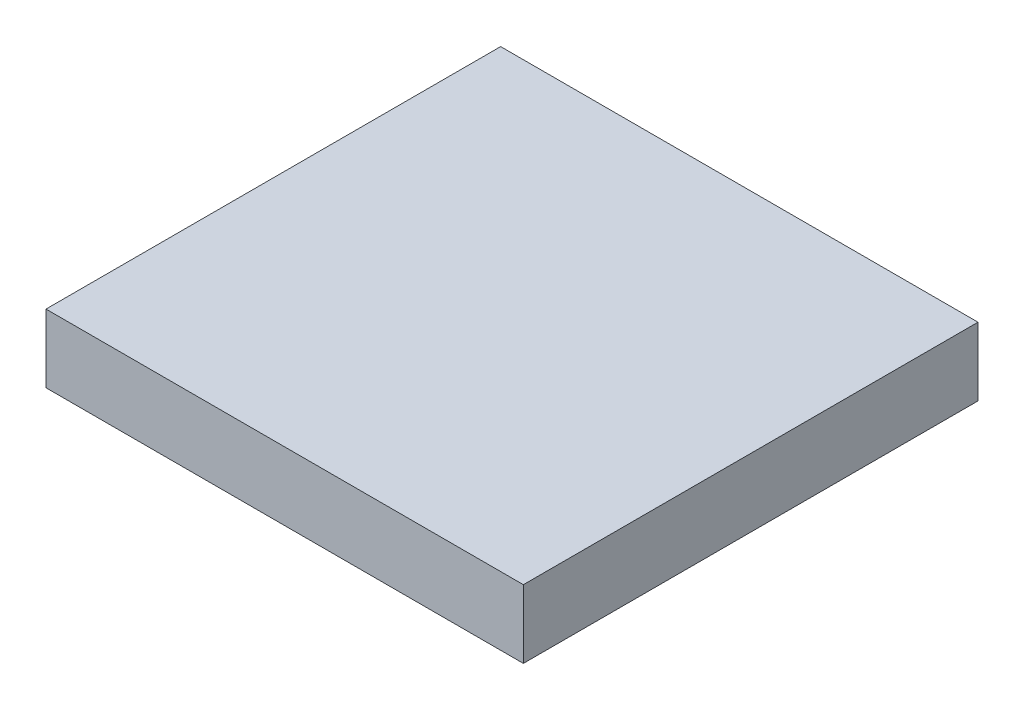
ISO-10303-21;
HEADER;
FILE_DESCRIPTION(('STEP AP214'),'2;1');
FILE_NAME('part.step','',(''),(''),'','','');
FILE_SCHEMA(('AUTOMOTIVE_DESIGN { 1 0 10303 214 1 1 1 1 }'));
ENDSEC;
DATA;
#1=APPLICATION_CONTEXT('core data for automotive mechanical design processes');
#2=APPLICATION_PROTOCOL_DEFINITION('international standard','automotive_design',2000,#1);
#3=PRODUCT_CONTEXT('',#1,'mechanical');
#4=PRODUCT('Part','Part','',(#3));
#5=PRODUCT_RELATED_PRODUCT_CATEGORY('part','',(#4));
#6=PRODUCT_DEFINITION_FORMATION('','',#4);
#7=PRODUCT_DEFINITION_CONTEXT('part definition',#1,'design');
#8=PRODUCT_DEFINITION('design','',#6,#7);
#9=PRODUCT_DEFINITION_SHAPE('','',#8);
#10=(LENGTH_UNIT() NAMED_UNIT(*) SI_UNIT(.MILLI.,.METRE.));
#11=(NAMED_UNIT(*) PLANE_ANGLE_UNIT() SI_UNIT($,.RADIAN.));
#12=(NAMED_UNIT(*) SI_UNIT($,.STERADIAN.) SOLID_ANGLE_UNIT());
#13=UNCERTAINTY_MEASURE_WITH_UNIT(LENGTH_MEASURE(1.E-05),#10,'distance_accuracy_value','');
#14=(GEOMETRIC_REPRESENTATION_CONTEXT(3) GLOBAL_UNCERTAINTY_ASSIGNED_CONTEXT((#13)) GLOBAL_UNIT_ASSIGNED_CONTEXT((#10,
#11,#12)) REPRESENTATION_CONTEXT('',''));
#15=CARTESIAN_POINT('',(0.,0.,0.));
#16=DIRECTION('',(0.,0.,1.));
#17=DIRECTION('',(1.,0.,0.));
#18=AXIS2_PLACEMENT_3D('',#15,#16,#17);
#19=CARTESIAN_POINT('',(21.,6.,-20.));
#20=DIRECTION('',(-1.,0.,0.));
#21=DIRECTION('',(0.,0.,1.));
#22=AXIS2_PLACEMENT_3D('',#19,#20,#21);
#23=PLANE('',#22);
#24=DIRECTION('',(0.,0.,-1.));
#25=VECTOR('',#24,1.);
#26=CARTESIAN_POINT('',(21.,0.,-20.));
#27=LINE('',#26,#25);
#28=CARTESIAN_POINT('',(21.,0.,20.));
#29=VERTEX_POINT('',#28);
#30=CARTESIAN_POINT('',(21.,0.,-20.));
#31=VERTEX_POINT('',#30);
#32=EDGE_CURVE('E96',#29,#31,#27,.T.);
#33=ORIENTED_EDGE('',*,*,#32,.T.);
#34=DIRECTION('',(0.,-1.,0.));
#35=VECTOR('',#34,1.);
#36=CARTESIAN_POINT('',(21.,6.,-20.));
#37=LINE('',#36,#35);
#38=CARTESIAN_POINT('',(21.,6.,-20.));
#39=VERTEX_POINT('',#38);
#40=EDGE_CURVE('E11',#39,#31,#37,.T.);
#41=ORIENTED_EDGE('',*,*,#40,.F.);
#42=DIRECTION('',(0.,0.,-1.));
#43=VECTOR('',#42,1.);
#44=CARTESIAN_POINT('',(21.,6.,-20.));
#45=LINE('',#44,#43);
#46=CARTESIAN_POINT('',(21.,6.,20.));
#47=VERTEX_POINT('',#46);
#48=EDGE_CURVE('E84',#47,#39,#45,.T.);
#49=ORIENTED_EDGE('',*,*,#48,.F.);
#50=DIRECTION('',(0.,-1.,0.));
#51=VECTOR('',#50,1.);
#52=CARTESIAN_POINT('',(21.,6.,20.));
#53=LINE('',#52,#51);
#54=EDGE_CURVE('E92',#47,#29,#53,.T.);
#55=ORIENTED_EDGE('',*,*,#54,.T.);
#56=EDGE_LOOP('',(#33,#41,#49,#55));
#57=FACE_BOUND('',#56,.T.);
#58=ADVANCED_FACE('F33',(#57),#23,.F.);
#59=CARTESIAN_POINT('',(-21.,6.,-20.));
#60=DIRECTION('',(0.,0.,1.));
#61=DIRECTION('',(1.,0.,0.));
#62=AXIS2_PLACEMENT_3D('',#59,#60,#61);
#63=PLANE('',#62);
#64=DIRECTION('',(-1.,0.,0.));
#65=VECTOR('',#64,1.);
#66=CARTESIAN_POINT('',(-21.,0.,-20.));
#67=LINE('',#66,#65);
#68=CARTESIAN_POINT('',(-21.,0.,-20.));
#69=VERTEX_POINT('',#68);
#70=EDGE_CURVE('E88',#31,#69,#67,.T.);
#71=ORIENTED_EDGE('',*,*,#70,.T.);
#72=DIRECTION('',(0.,-1.,0.));
#73=VECTOR('',#72,1.);
#74=CARTESIAN_POINT('',(-21.,6.,-20.));
#75=LINE('',#74,#73);
#76=CARTESIAN_POINT('',(-21.,6.,-20.));
#77=VERTEX_POINT('',#76);
#78=EDGE_CURVE('E41',#77,#69,#75,.T.);
#79=ORIENTED_EDGE('',*,*,#78,.F.);
#80=DIRECTION('',(-1.,0.,0.));
#81=VECTOR('',#80,1.);
#82=CARTESIAN_POINT('',(-21.,6.,-20.));
#83=LINE('',#82,#81);
#84=EDGE_CURVE('E79',#39,#77,#83,.T.);
#85=ORIENTED_EDGE('',*,*,#84,.F.);
#86=ORIENTED_EDGE('',*,*,#40,.T.);
#87=EDGE_LOOP('',(#71,#79,#85,#86));
#88=FACE_BOUND('',#87,.T.);
#89=ADVANCED_FACE('F87',(#88),#63,.F.);
#90=CARTESIAN_POINT('',(-21.,6.,-20.));
#91=DIRECTION('',(1.,0.,0.));
#92=DIRECTION('',(0.,0.,-1.));
#93=AXIS2_PLACEMENT_3D('',#90,#91,#92);
#94=PLANE('',#93);
#95=DIRECTION('',(0.,0.,1.));
#96=VECTOR('',#95,1.);
#97=CARTESIAN_POINT('',(-21.,0.,-20.));
#98=LINE('',#97,#96);
#99=CARTESIAN_POINT('',(-21.,0.,20.));
#100=VERTEX_POINT('',#99);
#101=EDGE_CURVE('E66',#69,#100,#98,.T.);
#102=ORIENTED_EDGE('',*,*,#101,.T.);
#103=DIRECTION('',(0.,-1.,0.));
#104=VECTOR('',#103,1.);
#105=CARTESIAN_POINT('',(-21.,6.,20.));
#106=LINE('',#105,#104);
#107=CARTESIAN_POINT('',(-21.,6.,20.));
#108=VERTEX_POINT('',#107);
#109=EDGE_CURVE('E89',#108,#100,#106,.T.);
#110=ORIENTED_EDGE('',*,*,#109,.F.);
#111=DIRECTION('',(0.,0.,1.));
#112=VECTOR('',#111,1.);
#113=CARTESIAN_POINT('',(-21.,6.,-20.));
#114=LINE('',#113,#112);
#115=EDGE_CURVE('E82',#77,#108,#114,.T.);
#116=ORIENTED_EDGE('',*,*,#115,.F.);
#117=ORIENTED_EDGE('',*,*,#78,.T.);
#118=EDGE_LOOP('',(#102,#110,#116,#117));
#119=FACE_BOUND('',#118,.T.);
#120=ADVANCED_FACE('F90',(#119),#94,.F.);
#121=CARTESIAN_POINT('',(-21.,6.,20.));
#122=DIRECTION('',(0.,0.,-1.));
#123=DIRECTION('',(-1.,0.,0.));
#124=AXIS2_PLACEMENT_3D('',#121,#122,#123);
#125=PLANE('',#124);
#126=DIRECTION('',(1.,0.,0.));
#127=VECTOR('',#126,1.);
#128=CARTESIAN_POINT('',(-21.,0.,20.));
#129=LINE('',#128,#127);
#130=EDGE_CURVE('E72',#100,#29,#129,.T.);
#131=ORIENTED_EDGE('',*,*,#130,.T.);
#132=ORIENTED_EDGE('',*,*,#54,.F.);
#133=DIRECTION('',(1.,0.,0.));
#134=VECTOR('',#133,1.);
#135=CARTESIAN_POINT('',(-21.,6.,20.));
#136=LINE('',#135,#134);
#137=EDGE_CURVE('E49',#108,#47,#136,.T.);
#138=ORIENTED_EDGE('',*,*,#137,.F.);
#139=ORIENTED_EDGE('',*,*,#109,.T.);
#140=EDGE_LOOP('',(#131,#132,#138,#139));
#141=FACE_BOUND('',#140,.T.);
#142=ADVANCED_FACE('F103',(#141),#125,.F.);
#143=CARTESIAN_POINT('',(0.,6.,0.));
#144=DIRECTION('',(0.,1.,0.));
#145=DIRECTION('',(0.,0.,1.));
#146=AXIS2_PLACEMENT_3D('',#143,#144,#145);
#147=PLANE('',#146);
#148=ORIENTED_EDGE('',*,*,#48,.T.);
#149=ORIENTED_EDGE('',*,*,#84,.T.);
#150=ORIENTED_EDGE('',*,*,#115,.T.);
#151=ORIENTED_EDGE('',*,*,#137,.T.);
#152=EDGE_LOOP('',(#148,#149,#150,#151));
#153=FACE_BOUND('',#152,.T.);
#154=ADVANCED_FACE('F80',(#153),#147,.T.);
#155=CARTESIAN_POINT('',(0.,0.,0.));
#156=DIRECTION('',(0.,1.,0.));
#157=DIRECTION('',(0.,0.,1.));
#158=AXIS2_PLACEMENT_3D('',#155,#156,#157);
#159=PLANE('',#158);
#160=ORIENTED_EDGE('',*,*,#32,.F.);
#161=ORIENTED_EDGE('',*,*,#130,.F.);
#162=ORIENTED_EDGE('',*,*,#101,.F.);
#163=ORIENTED_EDGE('',*,*,#70,.F.);
#164=EDGE_LOOP('',(#160,#161,#162,#163));
#165=FACE_BOUND('',#164,.T.);
#166=ADVANCED_FACE('F106',(#165),#159,.F.);
#167=CLOSED_SHELL('',(#58,#89,#120,#142,#154,#166));
#168=MANIFOLD_SOLID_BREP('B2',#167);
#169=ADVANCED_BREP_SHAPE_REPRESENTATION('',(#18,#168),#14);
#170=SHAPE_DEFINITION_REPRESENTATION(#9,#169);
ENDSEC;
END-ISO-10303-21;
